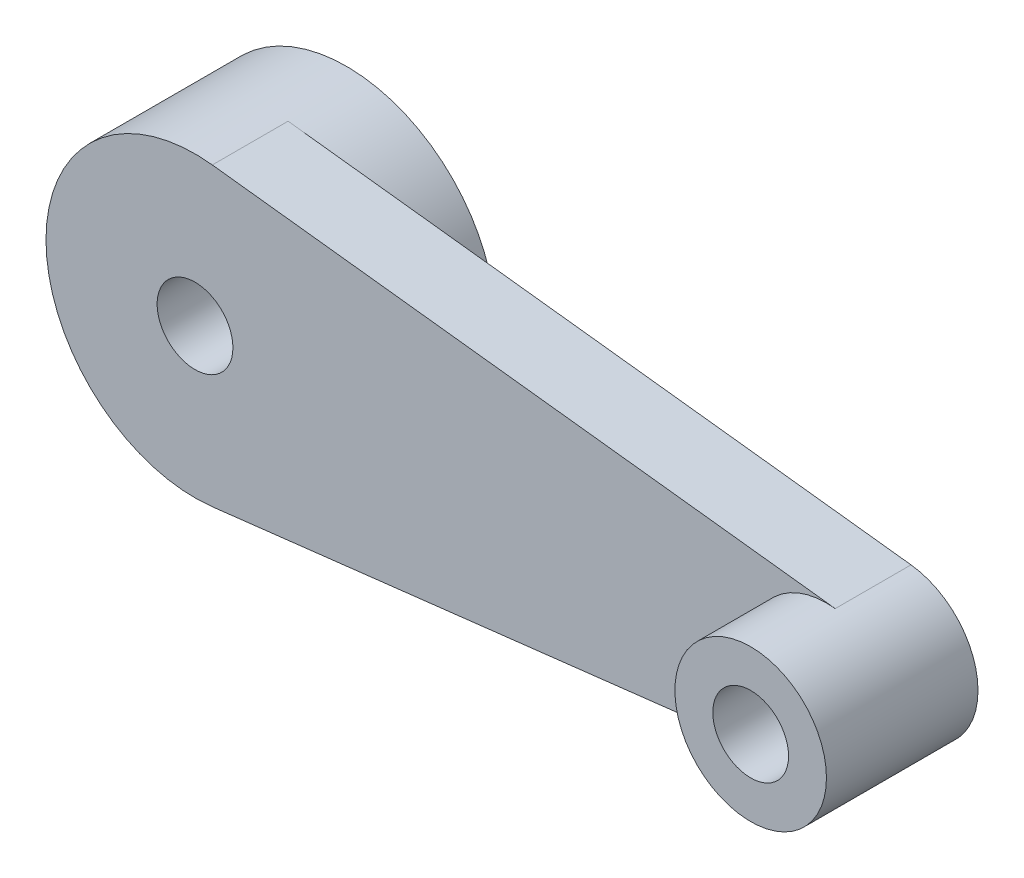
ISO-10303-21;
HEADER;
FILE_DESCRIPTION(('STEP AP214'),'2;1');
FILE_NAME('part.step','',(''),(''),'','','');
FILE_SCHEMA(('AUTOMOTIVE_DESIGN { 1 0 10303 214 1 1 1 1 }'));
ENDSEC;
DATA;
#1=APPLICATION_CONTEXT('core data for automotive mechanical design processes');
#2=APPLICATION_PROTOCOL_DEFINITION('international standard','automotive_design',2000,#1);
#3=PRODUCT_CONTEXT('',#1,'mechanical');
#4=PRODUCT('Part','Part','',(#3));
#5=PRODUCT_RELATED_PRODUCT_CATEGORY('part','',(#4));
#6=PRODUCT_DEFINITION_FORMATION('','',#4);
#7=PRODUCT_DEFINITION_CONTEXT('part definition',#1,'design');
#8=PRODUCT_DEFINITION('design','',#6,#7);
#9=PRODUCT_DEFINITION_SHAPE('','',#8);
#10=(LENGTH_UNIT() NAMED_UNIT(*) SI_UNIT(.MILLI.,.METRE.));
#11=(NAMED_UNIT(*) PLANE_ANGLE_UNIT() SI_UNIT($,.RADIAN.));
#12=(NAMED_UNIT(*) SI_UNIT($,.STERADIAN.) SOLID_ANGLE_UNIT());
#13=UNCERTAINTY_MEASURE_WITH_UNIT(LENGTH_MEASURE(1.E-05),#10,'distance_accuracy_value','');
#14=(GEOMETRIC_REPRESENTATION_CONTEXT(3) GLOBAL_UNCERTAINTY_ASSIGNED_CONTEXT((#13)) GLOBAL_UNIT_ASSIGNED_CONTEXT((#10,
#11,#12)) REPRESENTATION_CONTEXT('',''));
#15=CARTESIAN_POINT('',(0.,0.,0.));
#16=DIRECTION('',(0.,0.,1.));
#17=DIRECTION('',(1.,0.,0.));
#18=AXIS2_PLACEMENT_3D('',#15,#16,#17);
#19=CARTESIAN_POINT('',(35.2447307833003,39.645022473161,3.));
#20=DIRECTION('',(0.,0.,1.));
#21=DIRECTION('',(1.,0.,0.));
#22=AXIS2_PLACEMENT_3D('',#19,#20,#21);
#23=PLANE('',#22);
#24=CARTESIAN_POINT('',(35.2447307833003,39.645022473161,3.));
#25=DIRECTION('',(0.,0.,1.));
#26=DIRECTION('',(1.,0.,0.));
#27=AXIS2_PLACEMENT_3D('',#24,#25,#26);
#28=CIRCLE('',#27,1.49999999999995);
#29=CARTESIAN_POINT('',(36.7447307833002,39.645022473161,3.));
#30=VERTEX_POINT('',#29);
#31=EDGE_CURVE('E114',#30,#30,#28,.T.);
#32=ORIENTED_EDGE('',*,*,#31,.F.);
#33=EDGE_LOOP('',(#32));
#34=FACE_BOUND('',#33,.T.);
#35=DIRECTION('',(0.993249213440414,0.116,0.));
#36=VECTOR('',#35,1.);
#37=CARTESIAN_POINT('',(60.5927307833002,36.6652748328398,3.));
#38=LINE('',#37,#36);
#39=CARTESIAN_POINT('',(35.9291307833002,33.7848521138626,3.));
#40=VERTEX_POINT('',#39);
#41=CARTESIAN_POINT('',(60.5927307833002,36.6652748328398,3.));
#42=VERTEX_POINT('',#41);
#43=EDGE_CURVE('E80',#40,#42,#38,.T.);
#44=ORIENTED_EDGE('',*,*,#43,.T.);
#45=CARTESIAN_POINT('',(60.2447307833002,39.645022473161,3.));
#46=DIRECTION('',(0.,0.,1.));
#47=DIRECTION('',(1.,0.,0.));
#48=AXIS2_PLACEMENT_3D('',#45,#46,#47);
#49=CIRCLE('',#48,3.);
#50=CARTESIAN_POINT('',(60.5927307833002,42.6247701134823,3.));
#51=VERTEX_POINT('',#50);
#52=EDGE_CURVE('E94',#42,#51,#49,.F.);
#53=ORIENTED_EDGE('',*,*,#52,.T.);
#54=DIRECTION('',(-0.993249213440414,0.116,0.));
#55=VECTOR('',#54,1.);
#56=CARTESIAN_POINT('',(35.9291307833002,45.5051928324595,3.));
#57=LINE('',#56,#55);
#58=CARTESIAN_POINT('',(35.9291307833002,45.5051928324595,3.));
#59=VERTEX_POINT('',#58);
#60=EDGE_CURVE('E52',#51,#59,#57,.T.);
#61=ORIENTED_EDGE('',*,*,#60,.T.);
#62=CARTESIAN_POINT('',(35.2447307833003,39.645022473161,3.));
#63=DIRECTION('',(0.,0.,1.));
#64=DIRECTION('',(1.,0.,0.));
#65=AXIS2_PLACEMENT_3D('',#62,#63,#64);
#66=CIRCLE('',#65,5.9);
#67=EDGE_CURVE('E120',#59,#40,#66,.T.);
#68=ORIENTED_EDGE('',*,*,#67,.T.);
#69=EDGE_LOOP('',(#44,#53,#61,#68));
#70=FACE_BOUND('',#69,.T.);
#71=ADVANCED_FACE('F33',(#34,#70),#23,.T.);
#72=CARTESIAN_POINT('',(35.2447307833003,39.645022473161,0.));
#73=DIRECTION('',(0.,0.,1.));
#74=DIRECTION('',(1.,0.,0.));
#75=AXIS2_PLACEMENT_3D('',#72,#73,#74);
#76=PLANE('',#75);
#77=CARTESIAN_POINT('',(35.2447307833003,39.645022473161,0.));
#78=DIRECTION('',(0.,0.,1.));
#79=DIRECTION('',(1.,0.,0.));
#80=AXIS2_PLACEMENT_3D('',#77,#78,#79);
#81=CIRCLE('',#80,1.49999999999995);
#82=CARTESIAN_POINT('',(36.7447307833002,39.645022473161,0.));
#83=VERTEX_POINT('',#82);
#84=EDGE_CURVE('E113',#83,#83,#81,.T.);
#85=ORIENTED_EDGE('',*,*,#84,.T.);
#86=EDGE_LOOP('',(#85));
#87=FACE_BOUND('',#86,.T.);
#88=CARTESIAN_POINT('',(35.2447307833002,39.645022473161,0.));
#89=DIRECTION('',(0.,0.,1.));
#90=DIRECTION('',(1.,0.,0.));
#91=AXIS2_PLACEMENT_3D('',#88,#89,#90);
#92=CIRCLE('',#91,2.75);
#93=CARTESIAN_POINT('',(37.9947307833002,39.645022473161,0.));
#94=VERTEX_POINT('',#93);
#95=EDGE_CURVE('E11',#94,#94,#92,.T.);
#96=ORIENTED_EDGE('',*,*,#95,.F.);
#97=EDGE_LOOP('',(#96));
#98=FACE_BOUND('',#97,.T.);
#99=ADVANCED_FACE('F145',(#87,#98),#76,.F.);
#100=CARTESIAN_POINT('',(60.2447307833002,39.645022473161,0.));
#101=DIRECTION('',(0.,0.,1.));
#102=DIRECTION('',(1.,0.,0.));
#103=AXIS2_PLACEMENT_3D('',#100,#101,#102);
#104=CIRCLE('',#103,3.);
#105=CARTESIAN_POINT('',(60.5927307833002,36.6652748328398,0.));
#106=VERTEX_POINT('',#105);
#107=CARTESIAN_POINT('',(60.5927307833002,42.6247701134823,0.));
#108=VERTEX_POINT('',#107);
#109=EDGE_CURVE('E68',#106,#108,#104,.T.);
#110=ORIENTED_EDGE('',*,*,#109,.F.);
#111=DIRECTION('',(0.993249213440414,0.116,0.));
#112=VECTOR('',#111,1.);
#113=CARTESIAN_POINT('',(60.5927307833002,36.6652748328398,0.));
#114=LINE('',#113,#112);
#115=CARTESIAN_POINT('',(35.9291307833002,33.7848521138626,0.));
#116=VERTEX_POINT('',#115);
#117=EDGE_CURVE('E117',#116,#106,#114,.T.);
#118=ORIENTED_EDGE('',*,*,#117,.F.);
#119=CARTESIAN_POINT('',(35.2447307833002,39.645022473161,0.));
#120=DIRECTION('',(0.,0.,1.));
#121=DIRECTION('',(1.,0.,0.));
#122=AXIS2_PLACEMENT_3D('',#119,#120,#121);
#123=CIRCLE('',#122,5.9);
#124=CARTESIAN_POINT('',(35.9291307833002,45.5051928324595,0.));
#125=VERTEX_POINT('',#124);
#126=EDGE_CURVE('E43',#116,#125,#123,.T.);
#127=ORIENTED_EDGE('',*,*,#126,.T.);
#128=DIRECTION('',(-0.993249213440414,0.116,0.));
#129=VECTOR('',#128,1.);
#130=CARTESIAN_POINT('',(35.9291307833002,45.5051928324595,0.));
#131=LINE('',#130,#129);
#132=EDGE_CURVE('E122',#108,#125,#131,.T.);
#133=ORIENTED_EDGE('',*,*,#132,.F.);
#134=EDGE_LOOP('',(#110,#118,#127,#133));
#135=FACE_BOUND('',#134,.T.);
#136=CARTESIAN_POINT('',(60.2447307833002,39.645022473161,0.));
#137=DIRECTION('',(0.,0.,1.));
#138=DIRECTION('',(1.,0.,0.));
#139=AXIS2_PLACEMENT_3D('',#136,#137,#138);
#140=CIRCLE('',#139,1.49999999999997);
#141=CARTESIAN_POINT('',(61.7447307833002,39.645022473161,0.));
#142=VERTEX_POINT('',#141);
#143=EDGE_CURVE('E110',#142,#142,#140,.T.);
#144=ORIENTED_EDGE('',*,*,#143,.T.);
#145=EDGE_LOOP('',(#144));
#146=FACE_BOUND('',#145,.T.);
#147=ADVANCED_FACE('F142',(#135,#146),#76,.F.);
#148=CARTESIAN_POINT('',(35.2447307833003,39.645022473161,3.));
#149=DIRECTION('',(0.,0.,-1.));
#150=DIRECTION('',(-1.,0.,0.));
#151=AXIS2_PLACEMENT_3D('',#148,#149,#150);
#152=CYLINDRICAL_SURFACE('',#151,5.9);
#153=DIRECTION('',(0.,0.,-1.));
#154=VECTOR('',#153,1.);
#155=CARTESIAN_POINT('',(35.9291307833002,45.5051928324595,3.));
#156=LINE('',#155,#154);
#157=EDGE_CURVE('E88',#59,#125,#156,.T.);
#158=ORIENTED_EDGE('',*,*,#157,.T.);
#159=ORIENTED_EDGE('',*,*,#126,.F.);
#160=DIRECTION('',(0.,0.,-1.));
#161=VECTOR('',#160,1.);
#162=CARTESIAN_POINT('',(35.9291307833002,33.7848521138626,3.));
#163=LINE('',#162,#161);
#164=EDGE_CURVE('E126',#40,#116,#163,.T.);
#165=ORIENTED_EDGE('',*,*,#164,.F.);
#166=ORIENTED_EDGE('',*,*,#67,.F.);
#167=EDGE_LOOP('',(#158,#159,#165,#166));
#168=FACE_BOUND('',#167,.T.);
#169=CARTESIAN_POINT('',(35.2447307833002,39.645022473161,-3.));
#170=DIRECTION('',(0.,0.,1.));
#171=DIRECTION('',(1.,0.,0.));
#172=AXIS2_PLACEMENT_3D('',#169,#170,#171);
#173=CIRCLE('',#172,5.9);
#174=CARTESIAN_POINT('',(41.1447307833002,39.645022473161,-3.));
#175=VERTEX_POINT('',#174);
#176=EDGE_CURVE('E101',#175,#175,#173,.T.);
#177=ORIENTED_EDGE('',*,*,#176,.T.);
#178=EDGE_LOOP('',(#177));
#179=FACE_BOUND('',#178,.T.);
#180=ADVANCED_FACE('F35',(#168,#179),#152,.T.);
#181=CARTESIAN_POINT('',(60.5927307833002,36.6652748328398,3.));
#182=DIRECTION('',(-0.116,0.993249213440413,0.));
#183=DIRECTION('',(-0.993249213440414,-0.116,0.));
#184=AXIS2_PLACEMENT_3D('',#181,#182,#183);
#185=PLANE('',#184);
#186=ORIENTED_EDGE('',*,*,#117,.T.);
#187=DIRECTION('',(0.,0.,-1.));
#188=VECTOR('',#187,1.);
#189=CARTESIAN_POINT('',(60.5927307833002,36.6652748328398,3.));
#190=LINE('',#189,#188);
#191=EDGE_CURVE('E95',#42,#106,#190,.T.);
#192=ORIENTED_EDGE('',*,*,#191,.F.);
#193=ORIENTED_EDGE('',*,*,#43,.F.);
#194=ORIENTED_EDGE('',*,*,#164,.T.);
#195=EDGE_LOOP('',(#186,#192,#193,#194));
#196=FACE_BOUND('',#195,.T.);
#197=ADVANCED_FACE('F139',(#196),#185,.F.);
#198=CARTESIAN_POINT('',(60.2447307833002,39.645022473161,3.));
#199=DIRECTION('',(0.,0.,-1.));
#200=DIRECTION('',(-1.,0.,0.));
#201=AXIS2_PLACEMENT_3D('',#198,#199,#200);
#202=CYLINDRICAL_SURFACE('',#201,3.);
#203=ORIENTED_EDGE('',*,*,#109,.T.);
#204=DIRECTION('',(0.,0.,-1.));
#205=VECTOR('',#204,1.);
#206=CARTESIAN_POINT('',(60.5927307833002,42.6247701134823,3.));
#207=LINE('',#206,#205);
#208=EDGE_CURVE('E86',#51,#108,#207,.T.);
#209=ORIENTED_EDGE('',*,*,#208,.F.);
#210=ORIENTED_EDGE('',*,*,#52,.F.);
#211=ORIENTED_EDGE('',*,*,#191,.T.);
#212=EDGE_LOOP('',(#203,#209,#210,#211));
#213=FACE_BOUND('',#212,.T.);
#214=CARTESIAN_POINT('',(60.2447307833002,39.645022473161,6.));
#215=DIRECTION('',(0.,0.,1.));
#216=DIRECTION('',(1.,0.,0.));
#217=AXIS2_PLACEMENT_3D('',#214,#215,#216);
#218=CIRCLE('',#217,3.);
#219=CARTESIAN_POINT('',(63.2447307833002,39.645022473161,6.));
#220=VERTEX_POINT('',#219);
#221=EDGE_CURVE('E98',#220,#220,#218,.T.);
#222=ORIENTED_EDGE('',*,*,#221,.F.);
#223=EDGE_LOOP('',(#222));
#224=FACE_BOUND('',#223,.T.);
#225=ADVANCED_FACE('F92',(#213,#224),#202,.T.);
#226=CARTESIAN_POINT('',(35.9291307833002,45.5051928324595,3.));
#227=DIRECTION('',(-0.116,-0.993249213440413,0.));
#228=DIRECTION('',(0.993249213440414,-0.116,0.));
#229=AXIS2_PLACEMENT_3D('',#226,#227,#228);
#230=PLANE('',#229);
#231=ORIENTED_EDGE('',*,*,#132,.T.);
#232=ORIENTED_EDGE('',*,*,#157,.F.);
#233=ORIENTED_EDGE('',*,*,#60,.F.);
#234=ORIENTED_EDGE('',*,*,#208,.T.);
#235=EDGE_LOOP('',(#231,#232,#233,#234));
#236=FACE_BOUND('',#235,.T.);
#237=ADVANCED_FACE('F85',(#236),#230,.F.);
#238=CARTESIAN_POINT('',(35.2447307833003,39.645022473161,3.));
#239=DIRECTION('',(0.,0.,-1.));
#240=DIRECTION('',(-1.,0.,0.));
#241=AXIS2_PLACEMENT_3D('',#238,#239,#240);
#242=CYLINDRICAL_SURFACE('',#241,1.49999999999995);
#243=ORIENTED_EDGE('',*,*,#31,.T.);
#244=EDGE_LOOP('',(#243));
#245=FACE_BOUND('',#244,.T.);
#246=ORIENTED_EDGE('',*,*,#84,.F.);
#247=EDGE_LOOP('',(#246));
#248=FACE_BOUND('',#247,.T.);
#249=ADVANCED_FACE('F153',(#245,#248),#242,.F.);
#250=CARTESIAN_POINT('',(60.2447307833002,39.645022473161,3.));
#251=DIRECTION('',(0.,0.,-1.));
#252=DIRECTION('',(-1.,0.,0.));
#253=AXIS2_PLACEMENT_3D('',#250,#251,#252);
#254=CYLINDRICAL_SURFACE('',#253,1.49999999999997);
#255=ORIENTED_EDGE('',*,*,#143,.F.);
#256=EDGE_LOOP('',(#255));
#257=FACE_BOUND('',#256,.T.);
#258=CARTESIAN_POINT('',(60.2447307833002,39.645022473161,6.));
#259=DIRECTION('',(0.,0.,1.));
#260=DIRECTION('',(1.,0.,0.));
#261=AXIS2_PLACEMENT_3D('',#258,#259,#260);
#262=CIRCLE('',#261,1.5);
#263=CARTESIAN_POINT('',(61.7447307833002,39.645022473161,6.));
#264=VERTEX_POINT('',#263);
#265=EDGE_CURVE('E104',#264,#264,#262,.T.);
#266=ORIENTED_EDGE('',*,*,#265,.T.);
#267=EDGE_LOOP('',(#266));
#268=FACE_BOUND('',#267,.T.);
#269=ADVANCED_FACE('F149',(#257,#268),#254,.F.);
#270=CARTESIAN_POINT('',(35.2447307833002,39.645022473161,-3.));
#271=DIRECTION('',(0.,0.,1.));
#272=DIRECTION('',(1.,0.,0.));
#273=AXIS2_PLACEMENT_3D('',#270,#271,#272);
#274=PLANE('',#273);
#275=CARTESIAN_POINT('',(35.2447307833002,39.645022473161,-3.));
#276=DIRECTION('',(0.,0.,1.));
#277=DIRECTION('',(1.,0.,0.));
#278=AXIS2_PLACEMENT_3D('',#275,#276,#277);
#279=CIRCLE('',#278,2.75);
#280=CARTESIAN_POINT('',(37.9947307833002,39.645022473161,-3.));
#281=VERTEX_POINT('',#280);
#282=EDGE_CURVE('E97',#281,#281,#279,.T.);
#283=ORIENTED_EDGE('',*,*,#282,.T.);
#284=EDGE_LOOP('',(#283));
#285=FACE_BOUND('',#284,.T.);
#286=ORIENTED_EDGE('',*,*,#176,.F.);
#287=EDGE_LOOP('',(#286));
#288=FACE_BOUND('',#287,.T.);
#289=ADVANCED_FACE('F152',(#285,#288),#274,.F.);
#290=CARTESIAN_POINT('',(35.2447307833002,39.645022473161,-3.));
#291=DIRECTION('',(0.,0.,1.));
#292=DIRECTION('',(1.,0.,0.));
#293=AXIS2_PLACEMENT_3D('',#290,#291,#292);
#294=CYLINDRICAL_SURFACE('',#293,2.75);
#295=ORIENTED_EDGE('',*,*,#282,.F.);
#296=EDGE_LOOP('',(#295));
#297=FACE_BOUND('',#296,.T.);
#298=ORIENTED_EDGE('',*,*,#95,.T.);
#299=EDGE_LOOP('',(#298));
#300=FACE_BOUND('',#299,.T.);
#301=ADVANCED_FACE('F160',(#297,#300),#294,.F.);
#302=CARTESIAN_POINT('',(60.2447307833002,39.645022473161,6.));
#303=DIRECTION('',(0.,0.,1.));
#304=DIRECTION('',(1.,0.,0.));
#305=AXIS2_PLACEMENT_3D('',#302,#303,#304);
#306=PLANE('',#305);
#307=ORIENTED_EDGE('',*,*,#221,.T.);
#308=EDGE_LOOP('',(#307));
#309=FACE_BOUND('',#308,.T.);
#310=ORIENTED_EDGE('',*,*,#265,.F.);
#311=EDGE_LOOP('',(#310));
#312=FACE_BOUND('',#311,.T.);
#313=ADVANCED_FACE('F158',(#309,#312),#306,.T.);
#314=CLOSED_SHELL('',(#71,#99,#147,#180,#197,#225,#237,#249,#269,#289,#301,#313));
#315=MANIFOLD_SOLID_BREP('B2',#314);
#316=ADVANCED_BREP_SHAPE_REPRESENTATION('',(#18,#315),#14);
#317=SHAPE_DEFINITION_REPRESENTATION(#9,#316);
ENDSEC;
END-ISO-10303-21;
